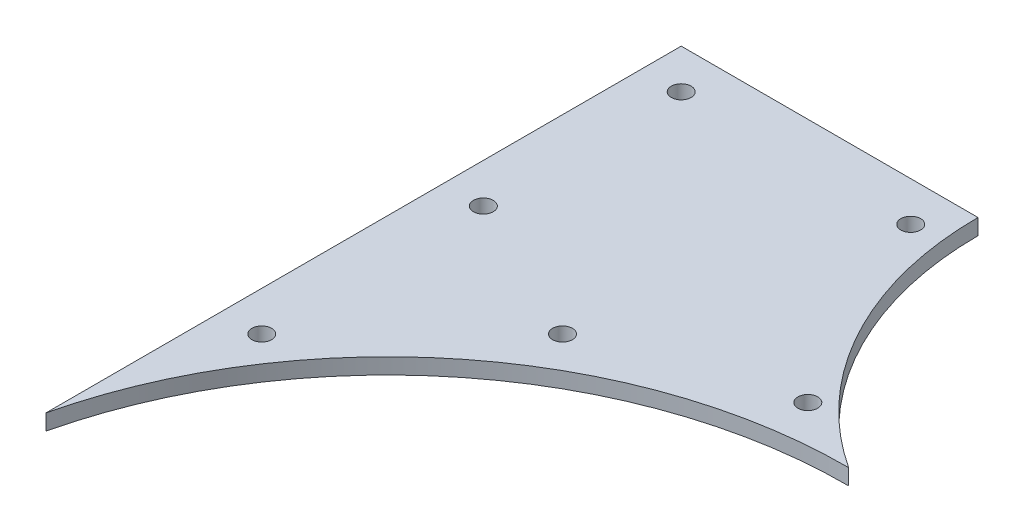
ISO-10303-21;
HEADER;
FILE_DESCRIPTION(('STEP AP214'),'2;1');
FILE_NAME('part.step','',(''),(''),'','','');
FILE_SCHEMA(('AUTOMOTIVE_DESIGN { 1 0 10303 214 1 1 1 1 }'));
ENDSEC;
DATA;
#1=APPLICATION_CONTEXT('core data for automotive mechanical design processes');
#2=APPLICATION_PROTOCOL_DEFINITION('international standard','automotive_design',2000,#1);
#3=PRODUCT_CONTEXT('',#1,'mechanical');
#4=PRODUCT('Part','Part','',(#3));
#5=PRODUCT_RELATED_PRODUCT_CATEGORY('part','',(#4));
#6=PRODUCT_DEFINITION_FORMATION('','',#4);
#7=PRODUCT_DEFINITION_CONTEXT('part definition',#1,'design');
#8=PRODUCT_DEFINITION('design','',#6,#7);
#9=PRODUCT_DEFINITION_SHAPE('','',#8);
#10=(LENGTH_UNIT() NAMED_UNIT(*) SI_UNIT(.MILLI.,.METRE.));
#11=(NAMED_UNIT(*) PLANE_ANGLE_UNIT() SI_UNIT($,.RADIAN.));
#12=(NAMED_UNIT(*) SI_UNIT($,.STERADIAN.) SOLID_ANGLE_UNIT());
#13=UNCERTAINTY_MEASURE_WITH_UNIT(LENGTH_MEASURE(1.E-05),#10,'distance_accuracy_value','');
#14=(GEOMETRIC_REPRESENTATION_CONTEXT(3) GLOBAL_UNCERTAINTY_ASSIGNED_CONTEXT((#13)) GLOBAL_UNIT_ASSIGNED_CONTEXT((#10,
#11,#12)) REPRESENTATION_CONTEXT('',''));
#15=CARTESIAN_POINT('',(0.,0.,0.));
#16=DIRECTION('',(0.,0.,1.));
#17=DIRECTION('',(1.,0.,0.));
#18=AXIS2_PLACEMENT_3D('',#15,#16,#17);
#19=CARTESIAN_POINT('',(-59.7955752031906,5.08,-143.404424796809));
#20=DIRECTION('',(0.,-1.,0.));
#21=DIRECTION('',(0.,0.,-1.));
#22=AXIS2_PLACEMENT_3D('',#19,#20,#21);
#23=CYLINDRICAL_SURFACE('',#22,147.32);
#24=CARTESIAN_POINT('',(-59.7955752031906,0.,-143.404424796809));
#25=DIRECTION('',(0.,1.,0.));
#26=DIRECTION('',(0.,0.,1.));
#27=AXIS2_PLACEMENT_3D('',#24,#25,#26);
#28=CIRCLE('',#27,147.32);
#29=CARTESIAN_POINT('',(-59.1886585501708,0.,-290.723174629192));
#30=VERTEX_POINT('',#29);
#31=CARTESIAN_POINT('',(-203.2,0.,-177.143917215876));
#32=VERTEX_POINT('',#31);
#33=EDGE_CURVE('E99',#30,#32,#28,.T.);
#34=ORIENTED_EDGE('',*,*,#33,.F.);
#35=DIRECTION('',(0.,-1.,0.));
#36=VECTOR('',#35,1.);
#37=CARTESIAN_POINT('',(-59.1886585501708,5.08,-290.723174629192));
#38=LINE('',#37,#36);
#39=CARTESIAN_POINT('',(-59.1886585501708,5.08,-290.723174629192));
#40=VERTEX_POINT('',#39);
#41=EDGE_CURVE('E11',#40,#30,#38,.T.);
#42=ORIENTED_EDGE('',*,*,#41,.F.);
#43=CARTESIAN_POINT('',(-59.7955752031906,5.08,-143.404424796809));
#44=DIRECTION('',(0.,1.,0.));
#45=DIRECTION('',(0.,0.,1.));
#46=AXIS2_PLACEMENT_3D('',#43,#44,#45);
#47=CIRCLE('',#46,147.32);
#48=CARTESIAN_POINT('',(-203.2,5.08,-177.143917215876));
#49=VERTEX_POINT('',#48);
#50=EDGE_CURVE('E92',#40,#49,#47,.T.);
#51=ORIENTED_EDGE('',*,*,#50,.T.);
#52=DIRECTION('',(0.,-1.,0.));
#53=VECTOR('',#52,1.);
#54=CARTESIAN_POINT('',(-203.2,5.08,-177.143917215876));
#55=LINE('',#54,#53);
#56=EDGE_CURVE('E73',#49,#32,#55,.T.);
#57=ORIENTED_EDGE('',*,*,#56,.T.);
#58=EDGE_LOOP('',(#34,#42,#51,#57));
#59=FACE_BOUND('',#58,.T.);
#60=ADVANCED_FACE('F35',(#59),#23,.F.);
#61=CARTESIAN_POINT('',(0.,5.08,-381.));
#62=DIRECTION('',(0.,-1.,0.));
#63=DIRECTION('',(0.,0.,-1.));
#64=AXIS2_PLACEMENT_3D('',#61,#62,#63);
#65=CYLINDRICAL_SURFACE('',#64,107.95);
#66=CARTESIAN_POINT('',(0.,0.,-381.));
#67=DIRECTION('',(0.,1.,0.));
#68=DIRECTION('',(0.,0.,1.));
#69=AXIS2_PLACEMENT_3D('',#66,#67,#68);
#70=CIRCLE('',#69,107.95);
#71=CARTESIAN_POINT('',(-107.95,0.,-381.));
#72=VERTEX_POINT('',#71);
#73=EDGE_CURVE('E86',#72,#30,#70,.T.);
#74=ORIENTED_EDGE('',*,*,#73,.F.);
#75=DIRECTION('',(0.,-1.,0.));
#76=VECTOR('',#75,1.);
#77=CARTESIAN_POINT('',(-107.95,5.08,-381.));
#78=LINE('',#77,#76);
#79=CARTESIAN_POINT('',(-107.95,5.08,-381.));
#80=VERTEX_POINT('',#79);
#81=EDGE_CURVE('E43',#80,#72,#78,.T.);
#82=ORIENTED_EDGE('',*,*,#81,.F.);
#83=CARTESIAN_POINT('',(0.,5.08,-381.));
#84=DIRECTION('',(0.,1.,0.));
#85=DIRECTION('',(0.,0.,1.));
#86=AXIS2_PLACEMENT_3D('',#83,#84,#85);
#87=CIRCLE('',#86,107.95);
#88=EDGE_CURVE('E84',#80,#40,#87,.T.);
#89=ORIENTED_EDGE('',*,*,#88,.T.);
#90=ORIENTED_EDGE('',*,*,#41,.T.);
#91=EDGE_LOOP('',(#74,#82,#89,#90));
#92=FACE_BOUND('',#91,.T.);
#93=ADVANCED_FACE('F82',(#92),#65,.F.);
#94=CARTESIAN_POINT('',(0.,5.08,-381.));
#95=DIRECTION('',(0.,0.,1.));
#96=DIRECTION('',(1.,0.,0.));
#97=AXIS2_PLACEMENT_3D('',#94,#95,#96);
#98=PLANE('',#97);
#99=DIRECTION('',(-1.,0.,0.));
#100=VECTOR('',#99,1.);
#101=CARTESIAN_POINT('',(0.,0.,-381.));
#102=LINE('',#101,#100);
#103=CARTESIAN_POINT('',(-203.2,0.,-381.));
#104=VERTEX_POINT('',#103);
#105=EDGE_CURVE('E66',#72,#104,#102,.T.);
#106=ORIENTED_EDGE('',*,*,#105,.T.);
#107=DIRECTION('',(0.,-1.,0.));
#108=VECTOR('',#107,1.);
#109=CARTESIAN_POINT('',(-203.2,5.08,-381.));
#110=LINE('',#109,#108);
#111=CARTESIAN_POINT('',(-203.2,5.08,-381.));
#112=VERTEX_POINT('',#111);
#113=EDGE_CURVE('E87',#112,#104,#110,.T.);
#114=ORIENTED_EDGE('',*,*,#113,.F.);
#115=DIRECTION('',(-1.,0.,0.));
#116=VECTOR('',#115,1.);
#117=CARTESIAN_POINT('',(0.,5.08,-381.));
#118=LINE('',#117,#116);
#119=EDGE_CURVE('E88',#80,#112,#118,.T.);
#120=ORIENTED_EDGE('',*,*,#119,.F.);
#121=ORIENTED_EDGE('',*,*,#81,.T.);
#122=EDGE_LOOP('',(#106,#114,#120,#121));
#123=FACE_BOUND('',#122,.T.);
#124=ADVANCED_FACE('F89',(#123),#98,.F.);
#125=CARTESIAN_POINT('',(-203.2,5.08,0.));
#126=DIRECTION('',(1.,0.,0.));
#127=DIRECTION('',(0.,0.,-1.));
#128=AXIS2_PLACEMENT_3D('',#125,#126,#127);
#129=PLANE('',#128);
#130=DIRECTION('',(0.,0.,1.));
#131=VECTOR('',#130,1.);
#132=CARTESIAN_POINT('',(-203.2,0.,0.));
#133=LINE('',#132,#131);
#134=EDGE_CURVE('E94',#104,#32,#133,.T.);
#135=ORIENTED_EDGE('',*,*,#134,.T.);
#136=ORIENTED_EDGE('',*,*,#56,.F.);
#137=DIRECTION('',(0.,0.,1.));
#138=VECTOR('',#137,1.);
#139=CARTESIAN_POINT('',(-203.2,5.08,0.));
#140=LINE('',#139,#138);
#141=EDGE_CURVE('E51',#112,#49,#140,.T.);
#142=ORIENTED_EDGE('',*,*,#141,.F.);
#143=ORIENTED_EDGE('',*,*,#113,.T.);
#144=EDGE_LOOP('',(#135,#136,#142,#143));
#145=FACE_BOUND('',#144,.T.);
#146=ADVANCED_FACE('F109',(#145),#129,.F.);
#147=CARTESIAN_POINT('',(0.,5.08,0.));
#148=DIRECTION('',(0.,1.,0.));
#149=DIRECTION('',(0.,0.,1.));
#150=AXIS2_PLACEMENT_3D('',#147,#148,#149);
#151=PLANE('',#150);
#152=CARTESIAN_POINT('',(-190.5,5.08,-304.8));
#153=DIRECTION('',(0.,1.,0.));
#154=DIRECTION('',(0.,0.,1.));
#155=AXIS2_PLACEMENT_3D('',#152,#153,#154);
#156=CIRCLE('',#155,3.17499999999997);
#157=CARTESIAN_POINT('',(-190.5,5.08,-301.625));
#158=VERTEX_POINT('',#157);
#159=EDGE_CURVE('E160',#158,#158,#156,.T.);
#160=ORIENTED_EDGE('',*,*,#159,.F.);
#161=EDGE_LOOP('',(#160));
#162=FACE_BOUND('',#161,.T.);
#163=CARTESIAN_POINT('',(-142.24,5.08,-281.94));
#164=DIRECTION('',(0.,1.,0.));
#165=DIRECTION('',(0.,0.,1.));
#166=AXIS2_PLACEMENT_3D('',#163,#164,#165);
#167=CIRCLE('',#166,3.175);
#168=CARTESIAN_POINT('',(-142.24,5.08,-278.765));
#169=VERTEX_POINT('',#168);
#170=EDGE_CURVE('E162',#169,#169,#167,.T.);
#171=ORIENTED_EDGE('',*,*,#170,.F.);
#172=EDGE_LOOP('',(#171));
#173=FACE_BOUND('',#172,.T.);
#174=CARTESIAN_POINT('',(-190.5,5.08,-368.3));
#175=DIRECTION('',(0.,1.,0.));
#176=DIRECTION('',(0.,0.,1.));
#177=AXIS2_PLACEMENT_3D('',#174,#175,#176);
#178=CIRCLE('',#177,3.17499999999997);
#179=CARTESIAN_POINT('',(-190.5,5.08,-365.125));
#180=VERTEX_POINT('',#179);
#181=EDGE_CURVE('E168',#180,#180,#178,.T.);
#182=ORIENTED_EDGE('',*,*,#181,.F.);
#183=EDGE_LOOP('',(#182));
#184=FACE_BOUND('',#183,.T.);
#185=CARTESIAN_POINT('',(-116.84,5.08,-368.3));
#186=DIRECTION('',(0.,1.,0.));
#187=DIRECTION('',(0.,0.,1.));
#188=AXIS2_PLACEMENT_3D('',#185,#186,#187);
#189=CIRCLE('',#188,3.175);
#190=CARTESIAN_POINT('',(-116.84,5.08,-365.125));
#191=VERTEX_POINT('',#190);
#192=EDGE_CURVE('E174',#191,#191,#189,.T.);
#193=ORIENTED_EDGE('',*,*,#192,.F.);
#194=EDGE_LOOP('',(#193));
#195=FACE_BOUND('',#194,.T.);
#196=CARTESIAN_POINT('',(-83.82,5.08,-302.26));
#197=DIRECTION('',(0.,1.,0.));
#198=DIRECTION('',(0.,0.,1.));
#199=AXIS2_PLACEMENT_3D('',#196,#197,#198);
#200=CIRCLE('',#199,3.175);
#201=CARTESIAN_POINT('',(-83.82,5.08,-299.085));
#202=VERTEX_POINT('',#201);
#203=EDGE_CURVE('E180',#202,#202,#200,.T.);
#204=ORIENTED_EDGE('',*,*,#203,.F.);
#205=EDGE_LOOP('',(#204));
#206=FACE_BOUND('',#205,.T.);
#207=CARTESIAN_POINT('',(-190.5,5.08,-233.68));
#208=DIRECTION('',(0.,1.,0.));
#209=DIRECTION('',(0.,0.,1.));
#210=AXIS2_PLACEMENT_3D('',#207,#208,#209);
#211=CIRCLE('',#210,3.17499999999997);
#212=CARTESIAN_POINT('',(-190.5,5.08,-230.505));
#213=VERTEX_POINT('',#212);
#214=EDGE_CURVE('E186',#213,#213,#211,.T.);
#215=ORIENTED_EDGE('',*,*,#214,.F.);
#216=EDGE_LOOP('',(#215));
#217=FACE_BOUND('',#216,.T.);
#218=ORIENTED_EDGE('',*,*,#50,.F.);
#219=ORIENTED_EDGE('',*,*,#88,.F.);
#220=ORIENTED_EDGE('',*,*,#119,.T.);
#221=ORIENTED_EDGE('',*,*,#141,.T.);
#222=EDGE_LOOP('',(#218,#219,#220,#221));
#223=FACE_BOUND('',#222,.T.);
#224=ADVANCED_FACE('F91',(#162,#173,#184,#195,#206,#217,#223),#151,.T.);
#225=CARTESIAN_POINT('',(0.,0.,0.));
#226=DIRECTION('',(0.,1.,0.));
#227=DIRECTION('',(0.,0.,1.));
#228=AXIS2_PLACEMENT_3D('',#225,#226,#227);
#229=PLANE('',#228);
#230=CARTESIAN_POINT('',(-190.5,0.,-304.8));
#231=DIRECTION('',(0.,1.,0.));
#232=DIRECTION('',(0.,0.,1.));
#233=AXIS2_PLACEMENT_3D('',#230,#231,#232);
#234=CIRCLE('',#233,3.17499999999997);
#235=CARTESIAN_POINT('',(-190.5,0.,-301.625));
#236=VERTEX_POINT('',#235);
#237=EDGE_CURVE('E157',#236,#236,#234,.T.);
#238=ORIENTED_EDGE('',*,*,#237,.T.);
#239=EDGE_LOOP('',(#238));
#240=FACE_BOUND('',#239,.T.);
#241=CARTESIAN_POINT('',(-142.24,0.,-281.94));
#242=DIRECTION('',(0.,1.,0.));
#243=DIRECTION('',(0.,0.,1.));
#244=AXIS2_PLACEMENT_3D('',#241,#242,#243);
#245=CIRCLE('',#244,3.175);
#246=CARTESIAN_POINT('',(-142.24,0.,-278.765));
#247=VERTEX_POINT('',#246);
#248=EDGE_CURVE('E165',#247,#247,#245,.T.);
#249=ORIENTED_EDGE('',*,*,#248,.T.);
#250=EDGE_LOOP('',(#249));
#251=FACE_BOUND('',#250,.T.);
#252=CARTESIAN_POINT('',(-190.5,0.,-368.3));
#253=DIRECTION('',(0.,1.,0.));
#254=DIRECTION('',(0.,0.,1.));
#255=AXIS2_PLACEMENT_3D('',#252,#253,#254);
#256=CIRCLE('',#255,3.17499999999997);
#257=CARTESIAN_POINT('',(-190.5,0.,-365.125));
#258=VERTEX_POINT('',#257);
#259=EDGE_CURVE('E171',#258,#258,#256,.T.);
#260=ORIENTED_EDGE('',*,*,#259,.T.);
#261=EDGE_LOOP('',(#260));
#262=FACE_BOUND('',#261,.T.);
#263=CARTESIAN_POINT('',(-116.84,0.,-368.3));
#264=DIRECTION('',(0.,1.,0.));
#265=DIRECTION('',(0.,0.,1.));
#266=AXIS2_PLACEMENT_3D('',#263,#264,#265);
#267=CIRCLE('',#266,3.175);
#268=CARTESIAN_POINT('',(-116.84,0.,-365.125));
#269=VERTEX_POINT('',#268);
#270=EDGE_CURVE('E177',#269,#269,#267,.T.);
#271=ORIENTED_EDGE('',*,*,#270,.T.);
#272=EDGE_LOOP('',(#271));
#273=FACE_BOUND('',#272,.T.);
#274=CARTESIAN_POINT('',(-83.82,0.,-302.26));
#275=DIRECTION('',(0.,1.,0.));
#276=DIRECTION('',(0.,0.,1.));
#277=AXIS2_PLACEMENT_3D('',#274,#275,#276);
#278=CIRCLE('',#277,3.175);
#279=CARTESIAN_POINT('',(-83.82,0.,-299.085));
#280=VERTEX_POINT('',#279);
#281=EDGE_CURVE('E183',#280,#280,#278,.T.);
#282=ORIENTED_EDGE('',*,*,#281,.T.);
#283=EDGE_LOOP('',(#282));
#284=FACE_BOUND('',#283,.T.);
#285=CARTESIAN_POINT('',(-190.5,0.,-233.68));
#286=DIRECTION('',(0.,1.,0.));
#287=DIRECTION('',(0.,0.,1.));
#288=AXIS2_PLACEMENT_3D('',#285,#286,#287);
#289=CIRCLE('',#288,3.17499999999997);
#290=CARTESIAN_POINT('',(-190.5,0.,-230.505));
#291=VERTEX_POINT('',#290);
#292=EDGE_CURVE('E102',#291,#291,#289,.T.);
#293=ORIENTED_EDGE('',*,*,#292,.T.);
#294=EDGE_LOOP('',(#293));
#295=FACE_BOUND('',#294,.T.);
#296=ORIENTED_EDGE('',*,*,#33,.T.);
#297=ORIENTED_EDGE('',*,*,#134,.F.);
#298=ORIENTED_EDGE('',*,*,#105,.F.);
#299=ORIENTED_EDGE('',*,*,#73,.T.);
#300=EDGE_LOOP('',(#296,#297,#298,#299));
#301=FACE_BOUND('',#300,.T.);
#302=ADVANCED_FACE('F111',(#240,#251,#262,#273,#284,#295,#301),#229,.F.);
#303=CARTESIAN_POINT('',(-190.5,0.,-233.68));
#304=DIRECTION('',(0.,1.,0.));
#305=DIRECTION('',(0.,0.,1.));
#306=AXIS2_PLACEMENT_3D('',#303,#304,#305);
#307=CYLINDRICAL_SURFACE('',#306,3.17499999999997);
#308=ORIENTED_EDGE('',*,*,#292,.F.);
#309=EDGE_LOOP('',(#308));
#310=FACE_BOUND('',#309,.T.);
#311=ORIENTED_EDGE('',*,*,#214,.T.);
#312=EDGE_LOOP('',(#311));
#313=FACE_BOUND('',#312,.T.);
#314=ADVANCED_FACE('F125',(#310,#313),#307,.F.);
#315=CARTESIAN_POINT('',(-83.82,0.,-302.26));
#316=DIRECTION('',(0.,1.,0.));
#317=DIRECTION('',(0.,0.,1.));
#318=AXIS2_PLACEMENT_3D('',#315,#316,#317);
#319=CYLINDRICAL_SURFACE('',#318,3.175);
#320=ORIENTED_EDGE('',*,*,#281,.F.);
#321=EDGE_LOOP('',(#320));
#322=FACE_BOUND('',#321,.T.);
#323=ORIENTED_EDGE('',*,*,#203,.T.);
#324=EDGE_LOOP('',(#323));
#325=FACE_BOUND('',#324,.T.);
#326=ADVANCED_FACE('F132',(#322,#325),#319,.F.);
#327=CARTESIAN_POINT('',(-116.84,0.,-368.3));
#328=DIRECTION('',(0.,1.,0.));
#329=DIRECTION('',(0.,0.,1.));
#330=AXIS2_PLACEMENT_3D('',#327,#328,#329);
#331=CYLINDRICAL_SURFACE('',#330,3.175);
#332=ORIENTED_EDGE('',*,*,#270,.F.);
#333=EDGE_LOOP('',(#332));
#334=FACE_BOUND('',#333,.T.);
#335=ORIENTED_EDGE('',*,*,#192,.T.);
#336=EDGE_LOOP('',(#335));
#337=FACE_BOUND('',#336,.T.);
#338=ADVANCED_FACE('F136',(#334,#337),#331,.F.);
#339=CARTESIAN_POINT('',(-190.5,0.,-368.3));
#340=DIRECTION('',(0.,1.,0.));
#341=DIRECTION('',(0.,0.,1.));
#342=AXIS2_PLACEMENT_3D('',#339,#340,#341);
#343=CYLINDRICAL_SURFACE('',#342,3.17499999999997);
#344=ORIENTED_EDGE('',*,*,#259,.F.);
#345=EDGE_LOOP('',(#344));
#346=FACE_BOUND('',#345,.T.);
#347=ORIENTED_EDGE('',*,*,#181,.T.);
#348=EDGE_LOOP('',(#347));
#349=FACE_BOUND('',#348,.T.);
#350=ADVANCED_FACE('F140',(#346,#349),#343,.F.);
#351=CARTESIAN_POINT('',(-142.24,0.,-281.94));
#352=DIRECTION('',(0.,1.,0.));
#353=DIRECTION('',(0.,0.,1.));
#354=AXIS2_PLACEMENT_3D('',#351,#352,#353);
#355=CYLINDRICAL_SURFACE('',#354,3.175);
#356=ORIENTED_EDGE('',*,*,#248,.F.);
#357=EDGE_LOOP('',(#356));
#358=FACE_BOUND('',#357,.T.);
#359=ORIENTED_EDGE('',*,*,#170,.T.);
#360=EDGE_LOOP('',(#359));
#361=FACE_BOUND('',#360,.T.);
#362=ADVANCED_FACE('F144',(#358,#361),#355,.F.);
#363=CARTESIAN_POINT('',(-190.5,0.,-304.8));
#364=DIRECTION('',(0.,1.,0.));
#365=DIRECTION('',(0.,0.,1.));
#366=AXIS2_PLACEMENT_3D('',#363,#364,#365);
#367=CYLINDRICAL_SURFACE('',#366,3.17499999999997);
#368=ORIENTED_EDGE('',*,*,#237,.F.);
#369=EDGE_LOOP('',(#368));
#370=FACE_BOUND('',#369,.T.);
#371=ORIENTED_EDGE('',*,*,#159,.T.);
#372=EDGE_LOOP('',(#371));
#373=FACE_BOUND('',#372,.T.);
#374=ADVANCED_FACE('F148',(#370,#373),#367,.F.);
#375=CLOSED_SHELL('',(#60,#93,#124,#146,#224,#302,#314,#326,#338,#350,#362,#374));
#376=MANIFOLD_SOLID_BREP('B2',#375);
#377=ADVANCED_BREP_SHAPE_REPRESENTATION('',(#18,#376),#14);
#378=SHAPE_DEFINITION_REPRESENTATION(#9,#377);
ENDSEC;
END-ISO-10303-21;
